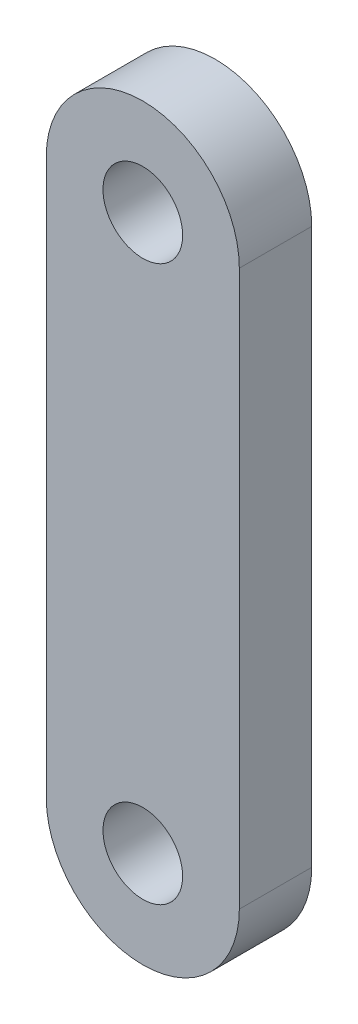
ISO-10303-21;
HEADER;
FILE_DESCRIPTION(('STEP AP214'),'2;1');
FILE_NAME('part.step','',(''),(''),'','','');
FILE_SCHEMA(('AUTOMOTIVE_DESIGN { 1 0 10303 214 1 1 1 1 }'));
ENDSEC;
DATA;
#1=APPLICATION_CONTEXT('core data for automotive mechanical design processes');
#2=APPLICATION_PROTOCOL_DEFINITION('international standard','automotive_design',2000,#1);
#3=PRODUCT_CONTEXT('',#1,'mechanical');
#4=PRODUCT('Part','Part','',(#3));
#5=PRODUCT_RELATED_PRODUCT_CATEGORY('part','',(#4));
#6=PRODUCT_DEFINITION_FORMATION('','',#4);
#7=PRODUCT_DEFINITION_CONTEXT('part definition',#1,'design');
#8=PRODUCT_DEFINITION('design','',#6,#7);
#9=PRODUCT_DEFINITION_SHAPE('','',#8);
#10=(LENGTH_UNIT() NAMED_UNIT(*) SI_UNIT(.MILLI.,.METRE.));
#11=(NAMED_UNIT(*) PLANE_ANGLE_UNIT() SI_UNIT($,.RADIAN.));
#12=(NAMED_UNIT(*) SI_UNIT($,.STERADIAN.) SOLID_ANGLE_UNIT());
#13=UNCERTAINTY_MEASURE_WITH_UNIT(LENGTH_MEASURE(1.E-05),#10,'distance_accuracy_value','');
#14=(GEOMETRIC_REPRESENTATION_CONTEXT(3) GLOBAL_UNCERTAINTY_ASSIGNED_CONTEXT((#13)) GLOBAL_UNIT_ASSIGNED_CONTEXT((#10,
#11,#12)) REPRESENTATION_CONTEXT('',''));
#15=CARTESIAN_POINT('',(0.,0.,0.));
#16=DIRECTION('',(0.,0.,1.));
#17=DIRECTION('',(1.,0.,0.));
#18=AXIS2_PLACEMENT_3D('',#15,#16,#17);
#19=CARTESIAN_POINT('',(0.,11.5,3.));
#20=DIRECTION('',(0.,0.,1.));
#21=DIRECTION('',(1.,0.,0.));
#22=AXIS2_PLACEMENT_3D('',#19,#20,#21);
#23=PLANE('',#22);
#24=CARTESIAN_POINT('',(0.,11.5,3.));
#25=DIRECTION('',(0.,0.,1.));
#26=DIRECTION('',(1.,0.,0.));
#27=AXIS2_PLACEMENT_3D('',#24,#25,#26);
#28=CIRCLE('',#27,1.65);
#29=CARTESIAN_POINT('',(1.65,11.5,3.));
#30=VERTEX_POINT('',#29);
#31=EDGE_CURVE('E102',#30,#30,#28,.T.);
#32=ORIENTED_EDGE('',*,*,#31,.F.);
#33=EDGE_LOOP('',(#32));
#34=FACE_BOUND('',#33,.T.);
#35=CARTESIAN_POINT('',(0.,11.5,3.));
#36=DIRECTION('',(0.,0.,1.));
#37=DIRECTION('',(1.,0.,0.));
#38=AXIS2_PLACEMENT_3D('',#35,#36,#37);
#39=CIRCLE('',#38,4.);
#40=CARTESIAN_POINT('',(3.99999999999999,11.5,3.));
#41=VERTEX_POINT('',#40);
#42=CARTESIAN_POINT('',(-4.,11.5,3.));
#43=VERTEX_POINT('',#42);
#44=EDGE_CURVE('E87',#41,#43,#39,.T.);
#45=ORIENTED_EDGE('',*,*,#44,.T.);
#46=DIRECTION('',(0.,-1.,0.));
#47=VECTOR('',#46,1.);
#48=CARTESIAN_POINT('',(-4.,11.5,3.));
#49=LINE('',#48,#47);
#50=CARTESIAN_POINT('',(-3.99999999999999,-11.5,3.));
#51=VERTEX_POINT('',#50);
#52=EDGE_CURVE('E82',#43,#51,#49,.T.);
#53=ORIENTED_EDGE('',*,*,#52,.T.);
#54=CARTESIAN_POINT('',(0.,-11.5,3.));
#55=DIRECTION('',(0.,0.,1.));
#56=DIRECTION('',(1.,0.,0.));
#57=AXIS2_PLACEMENT_3D('',#54,#55,#56);
#58=CIRCLE('',#57,4.);
#59=CARTESIAN_POINT('',(4.,-11.5,3.));
#60=VERTEX_POINT('',#59);
#61=EDGE_CURVE('E85',#51,#60,#58,.T.);
#62=ORIENTED_EDGE('',*,*,#61,.T.);
#63=DIRECTION('',(0.,1.,0.));
#64=VECTOR('',#63,1.);
#65=CARTESIAN_POINT('',(3.99999999999999,11.5,3.));
#66=LINE('',#65,#64);
#67=EDGE_CURVE('E52',#60,#41,#66,.T.);
#68=ORIENTED_EDGE('',*,*,#67,.T.);
#69=EDGE_LOOP('',(#45,#53,#62,#68));
#70=FACE_BOUND('',#69,.T.);
#71=CARTESIAN_POINT('',(0.,-11.5,3.));
#72=DIRECTION('',(0.,0.,1.));
#73=DIRECTION('',(1.,0.,0.));
#74=AXIS2_PLACEMENT_3D('',#71,#72,#73);
#75=CIRCLE('',#74,1.65);
#76=CARTESIAN_POINT('',(1.65,-11.5,3.));
#77=VERTEX_POINT('',#76);
#78=EDGE_CURVE('E117',#77,#77,#75,.T.);
#79=ORIENTED_EDGE('',*,*,#78,.F.);
#80=EDGE_LOOP('',(#79));
#81=FACE_BOUND('',#80,.T.);
#82=ADVANCED_FACE('F35',(#34,#70,#81),#23,.T.);
#83=CARTESIAN_POINT('',(0.,11.5,0.));
#84=DIRECTION('',(0.,0.,1.));
#85=DIRECTION('',(1.,0.,0.));
#86=AXIS2_PLACEMENT_3D('',#83,#84,#85);
#87=PLANE('',#86);
#88=CARTESIAN_POINT('',(0.,11.5,0.));
#89=DIRECTION('',(0.,0.,1.));
#90=DIRECTION('',(1.,0.,0.));
#91=AXIS2_PLACEMENT_3D('',#88,#89,#90);
#92=CIRCLE('',#91,4.);
#93=CARTESIAN_POINT('',(3.99999999999999,11.5,0.));
#94=VERTEX_POINT('',#93);
#95=CARTESIAN_POINT('',(-4.,11.5,0.));
#96=VERTEX_POINT('',#95);
#97=EDGE_CURVE('E99',#94,#96,#92,.T.);
#98=ORIENTED_EDGE('',*,*,#97,.F.);
#99=DIRECTION('',(0.,1.,0.));
#100=VECTOR('',#99,1.);
#101=CARTESIAN_POINT('',(3.99999999999999,11.5,0.));
#102=LINE('',#101,#100);
#103=CARTESIAN_POINT('',(4.,-11.5,0.));
#104=VERTEX_POINT('',#103);
#105=EDGE_CURVE('E75',#104,#94,#102,.T.);
#106=ORIENTED_EDGE('',*,*,#105,.F.);
#107=CARTESIAN_POINT('',(0.,-11.5,0.));
#108=DIRECTION('',(0.,0.,1.));
#109=DIRECTION('',(1.,0.,0.));
#110=AXIS2_PLACEMENT_3D('',#107,#108,#109);
#111=CIRCLE('',#110,4.);
#112=CARTESIAN_POINT('',(-3.99999999999999,-11.5,0.));
#113=VERTEX_POINT('',#112);
#114=EDGE_CURVE('E69',#113,#104,#111,.T.);
#115=ORIENTED_EDGE('',*,*,#114,.F.);
#116=DIRECTION('',(0.,-1.,0.));
#117=VECTOR('',#116,1.);
#118=CARTESIAN_POINT('',(-4.,11.5,0.));
#119=LINE('',#118,#117);
#120=EDGE_CURVE('E91',#96,#113,#119,.T.);
#121=ORIENTED_EDGE('',*,*,#120,.F.);
#122=EDGE_LOOP('',(#98,#106,#115,#121));
#123=FACE_BOUND('',#122,.T.);
#124=CARTESIAN_POINT('',(0.,11.5,0.));
#125=DIRECTION('',(0.,0.,1.));
#126=DIRECTION('',(1.,0.,0.));
#127=AXIS2_PLACEMENT_3D('',#124,#125,#126);
#128=CIRCLE('',#127,1.65);
#129=CARTESIAN_POINT('',(1.65,11.5,0.));
#130=VERTEX_POINT('',#129);
#131=EDGE_CURVE('E114',#130,#130,#128,.T.);
#132=ORIENTED_EDGE('',*,*,#131,.T.);
#133=EDGE_LOOP('',(#132));
#134=FACE_BOUND('',#133,.T.);
#135=CARTESIAN_POINT('',(0.,-11.5,0.));
#136=DIRECTION('',(0.,0.,1.));
#137=DIRECTION('',(1.,0.,0.));
#138=AXIS2_PLACEMENT_3D('',#135,#136,#137);
#139=CIRCLE('',#138,1.65);
#140=CARTESIAN_POINT('',(1.65,-11.5,0.));
#141=VERTEX_POINT('',#140);
#142=EDGE_CURVE('E120',#141,#141,#139,.T.);
#143=ORIENTED_EDGE('',*,*,#142,.T.);
#144=EDGE_LOOP('',(#143));
#145=FACE_BOUND('',#144,.T.);
#146=ADVANCED_FACE('F110',(#123,#134,#145),#87,.F.);
#147=CARTESIAN_POINT('',(0.,11.5,3.));
#148=DIRECTION('',(0.,0.,-1.));
#149=DIRECTION('',(-1.,0.,0.));
#150=AXIS2_PLACEMENT_3D('',#147,#148,#149);
#151=CYLINDRICAL_SURFACE('',#150,4.);
#152=ORIENTED_EDGE('',*,*,#97,.T.);
#153=DIRECTION('',(0.,0.,-1.));
#154=VECTOR('',#153,1.);
#155=CARTESIAN_POINT('',(-4.,11.5,3.));
#156=LINE('',#155,#154);
#157=EDGE_CURVE('E11',#43,#96,#156,.T.);
#158=ORIENTED_EDGE('',*,*,#157,.F.);
#159=ORIENTED_EDGE('',*,*,#44,.F.);
#160=DIRECTION('',(0.,0.,-1.));
#161=VECTOR('',#160,1.);
#162=CARTESIAN_POINT('',(3.99999999999999,11.5,3.));
#163=LINE('',#162,#161);
#164=EDGE_CURVE('E95',#41,#94,#163,.T.);
#165=ORIENTED_EDGE('',*,*,#164,.T.);
#166=EDGE_LOOP('',(#152,#158,#159,#165));
#167=FACE_BOUND('',#166,.T.);
#168=ADVANCED_FACE('F37',(#167),#151,.T.);
#169=CARTESIAN_POINT('',(-4.,11.5,3.));
#170=DIRECTION('',(1.,0.,0.));
#171=DIRECTION('',(0.,1.,0.));
#172=AXIS2_PLACEMENT_3D('',#169,#170,#171);
#173=PLANE('',#172);
#174=ORIENTED_EDGE('',*,*,#120,.T.);
#175=DIRECTION('',(0.,0.,-1.));
#176=VECTOR('',#175,1.);
#177=CARTESIAN_POINT('',(-3.99999999999999,-11.5,3.));
#178=LINE('',#177,#176);
#179=EDGE_CURVE('E44',#51,#113,#178,.T.);
#180=ORIENTED_EDGE('',*,*,#179,.F.);
#181=ORIENTED_EDGE('',*,*,#52,.F.);
#182=ORIENTED_EDGE('',*,*,#157,.T.);
#183=EDGE_LOOP('',(#174,#180,#181,#182));
#184=FACE_BOUND('',#183,.T.);
#185=ADVANCED_FACE('F90',(#184),#173,.F.);
#186=CARTESIAN_POINT('',(0.,-11.5,3.));
#187=DIRECTION('',(0.,0.,-1.));
#188=DIRECTION('',(-1.,0.,0.));
#189=AXIS2_PLACEMENT_3D('',#186,#187,#188);
#190=CYLINDRICAL_SURFACE('',#189,4.);
#191=ORIENTED_EDGE('',*,*,#114,.T.);
#192=DIRECTION('',(0.,0.,-1.));
#193=VECTOR('',#192,1.);
#194=CARTESIAN_POINT('',(4.,-11.5,3.));
#195=LINE('',#194,#193);
#196=EDGE_CURVE('E92',#60,#104,#195,.T.);
#197=ORIENTED_EDGE('',*,*,#196,.F.);
#198=ORIENTED_EDGE('',*,*,#61,.F.);
#199=ORIENTED_EDGE('',*,*,#179,.T.);
#200=EDGE_LOOP('',(#191,#197,#198,#199));
#201=FACE_BOUND('',#200,.T.);
#202=ADVANCED_FACE('F93',(#201),#190,.T.);
#203=CARTESIAN_POINT('',(3.99999999999999,11.5,3.));
#204=DIRECTION('',(-1.,0.,0.));
#205=DIRECTION('',(0.,-1.,0.));
#206=AXIS2_PLACEMENT_3D('',#203,#204,#205);
#207=PLANE('',#206);
#208=ORIENTED_EDGE('',*,*,#105,.T.);
#209=ORIENTED_EDGE('',*,*,#164,.F.);
#210=ORIENTED_EDGE('',*,*,#67,.F.);
#211=ORIENTED_EDGE('',*,*,#196,.T.);
#212=EDGE_LOOP('',(#208,#209,#210,#211));
#213=FACE_BOUND('',#212,.T.);
#214=ADVANCED_FACE('F107',(#213),#207,.F.);
#215=CARTESIAN_POINT('',(0.,11.5,3.));
#216=DIRECTION('',(0.,0.,-1.));
#217=DIRECTION('',(-1.,0.,0.));
#218=AXIS2_PLACEMENT_3D('',#215,#216,#217);
#219=CYLINDRICAL_SURFACE('',#218,1.65);
#220=ORIENTED_EDGE('',*,*,#31,.T.);
#221=EDGE_LOOP('',(#220));
#222=FACE_BOUND('',#221,.T.);
#223=ORIENTED_EDGE('',*,*,#131,.F.);
#224=EDGE_LOOP('',(#223));
#225=FACE_BOUND('',#224,.T.);
#226=ADVANCED_FACE('F137',(#222,#225),#219,.F.);
#227=CARTESIAN_POINT('',(0.,-11.5,3.));
#228=DIRECTION('',(0.,0.,-1.));
#229=DIRECTION('',(-1.,0.,0.));
#230=AXIS2_PLACEMENT_3D('',#227,#228,#229);
#231=CYLINDRICAL_SURFACE('',#230,1.65);
#232=ORIENTED_EDGE('',*,*,#78,.T.);
#233=EDGE_LOOP('',(#232));
#234=FACE_BOUND('',#233,.T.);
#235=ORIENTED_EDGE('',*,*,#142,.F.);
#236=EDGE_LOOP('',(#235));
#237=FACE_BOUND('',#236,.T.);
#238=ADVANCED_FACE('F126',(#234,#237),#231,.F.);
#239=CLOSED_SHELL('',(#82,#146,#168,#185,#202,#214,#226,#238));
#240=MANIFOLD_SOLID_BREP('B2',#239);
#241=ADVANCED_BREP_SHAPE_REPRESENTATION('',(#18,#240),#14);
#242=SHAPE_DEFINITION_REPRESENTATION(#9,#241);
ENDSEC;
END-ISO-10303-21;
